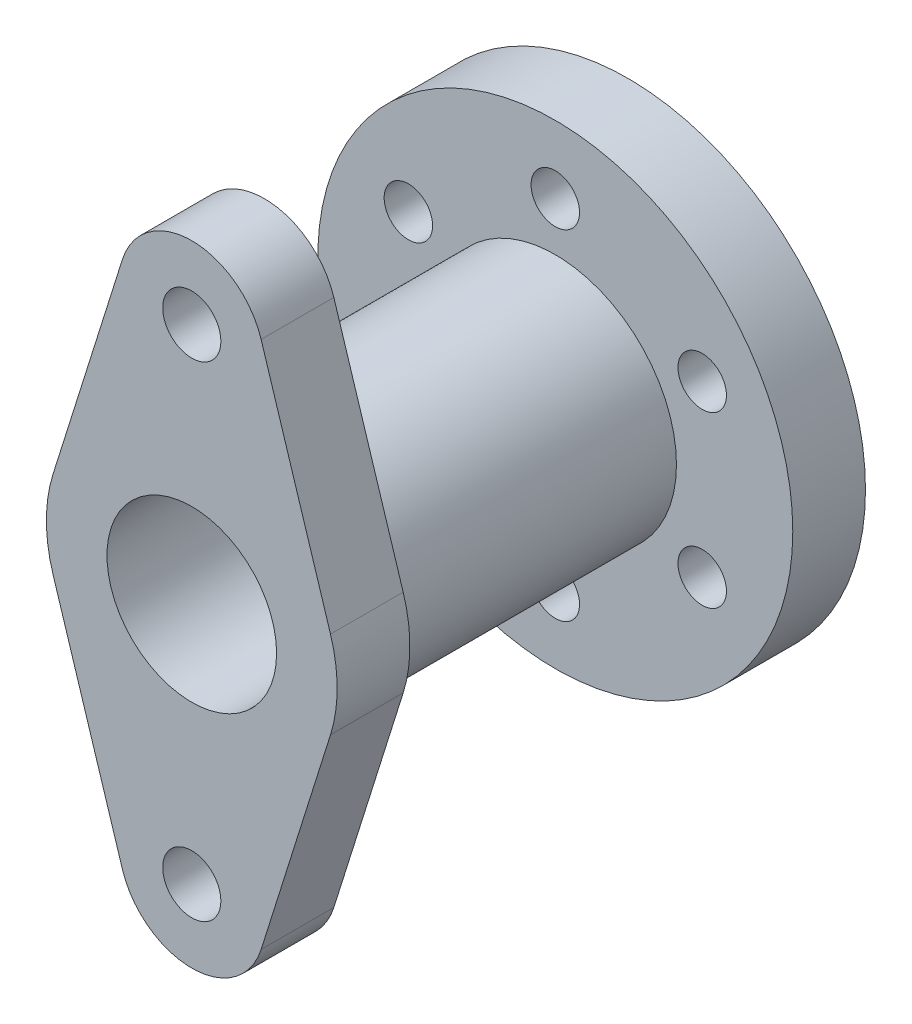
ISO-10303-21;
HEADER;
FILE_DESCRIPTION(('STEP AP214'),'2;1');
FILE_NAME('part.step','',(''),(''),'','','');
FILE_SCHEMA(('AUTOMOTIVE_DESIGN { 1 0 10303 214 1 1 1 1 }'));
ENDSEC;
DATA;
#1=APPLICATION_CONTEXT('core data for automotive mechanical design processes');
#2=APPLICATION_PROTOCOL_DEFINITION('international standard','automotive_design',2000,#1);
#3=PRODUCT_CONTEXT('',#1,'mechanical');
#4=PRODUCT('Part','Part','',(#3));
#5=PRODUCT_RELATED_PRODUCT_CATEGORY('part','',(#4));
#6=PRODUCT_DEFINITION_FORMATION('','',#4);
#7=PRODUCT_DEFINITION_CONTEXT('part definition',#1,'design');
#8=PRODUCT_DEFINITION('design','',#6,#7);
#9=PRODUCT_DEFINITION_SHAPE('','',#8);
#10=(LENGTH_UNIT() NAMED_UNIT(*) SI_UNIT(.MILLI.,.METRE.));
#11=(NAMED_UNIT(*) PLANE_ANGLE_UNIT() SI_UNIT($,.RADIAN.));
#12=(NAMED_UNIT(*) SI_UNIT($,.STERADIAN.) SOLID_ANGLE_UNIT());
#13=UNCERTAINTY_MEASURE_WITH_UNIT(LENGTH_MEASURE(1.E-05),#10,'distance_accuracy_value','');
#14=(GEOMETRIC_REPRESENTATION_CONTEXT(3) GLOBAL_UNCERTAINTY_ASSIGNED_CONTEXT((#13)) GLOBAL_UNIT_ASSIGNED_CONTEXT((#10,
#11,#12)) REPRESENTATION_CONTEXT('',''));
#15=CARTESIAN_POINT('',(0.,0.,0.));
#16=DIRECTION('',(0.,0.,1.));
#17=DIRECTION('',(1.,0.,0.));
#18=AXIS2_PLACEMENT_3D('',#15,#16,#17);
#19=CARTESIAN_POINT('',(0.,0.,15.));
#20=DIRECTION('',(0.,0.,-1.));
#21=DIRECTION('',(-1.,0.,0.));
#22=AXIS2_PLACEMENT_3D('',#19,#20,#21);
#23=CYLINDRICAL_SURFACE('',#22,49.);
#24=CARTESIAN_POINT('',(0.,0.,15.));
#25=DIRECTION('',(0.,0.,1.));
#26=DIRECTION('',(1.,0.,0.));
#27=AXIS2_PLACEMENT_3D('',#24,#25,#26);
#28=CIRCLE('',#27,49.);
#29=CARTESIAN_POINT('',(49.,0.,15.));
#30=VERTEX_POINT('',#29);
#31=EDGE_CURVE('E11',#30,#30,#28,.T.);
#32=ORIENTED_EDGE('',*,*,#31,.F.);
#33=EDGE_LOOP('',(#32));
#34=FACE_BOUND('',#33,.T.);
#35=CARTESIAN_POINT('',(0.,0.,0.));
#36=DIRECTION('',(0.,0.,1.));
#37=DIRECTION('',(1.,0.,0.));
#38=AXIS2_PLACEMENT_3D('',#35,#36,#37);
#39=CIRCLE('',#38,49.);
#40=CARTESIAN_POINT('',(49.,0.,0.));
#41=VERTEX_POINT('',#40);
#42=EDGE_CURVE('E42',#41,#41,#39,.T.);
#43=ORIENTED_EDGE('',*,*,#42,.T.);
#44=EDGE_LOOP('',(#43));
#45=FACE_BOUND('',#44,.T.);
#46=ADVANCED_FACE('F33',(#34,#45),#23,.T.);
#47=CARTESIAN_POINT('',(0.,0.,15.));
#48=DIRECTION('',(0.,0.,1.));
#49=DIRECTION('',(1.,0.,0.));
#50=AXIS2_PLACEMENT_3D('',#47,#48,#49);
#51=PLANE('',#50);
#52=CARTESIAN_POINT('',(0.,0.,15.));
#53=DIRECTION('',(0.,0.,1.));
#54=DIRECTION('',(1.,0.,0.));
#55=AXIS2_PLACEMENT_3D('',#52,#53,#54);
#56=CIRCLE('',#55,25.);
#57=CARTESIAN_POINT('',(25.,0.,15.));
#58=VERTEX_POINT('',#57);
#59=EDGE_CURVE('E161',#58,#58,#56,.T.);
#60=ORIENTED_EDGE('',*,*,#59,.F.);
#61=EDGE_LOOP('',(#60));
#62=FACE_BOUND('',#61,.T.);
#63=CARTESIAN_POINT('',(30.3108891324558,17.5000000000009,15.));
#64=DIRECTION('',(0.,0.,1.));
#65=DIRECTION('',(1.,0.,0.));
#66=AXIS2_PLACEMENT_3D('',#63,#64,#65);
#67=CIRCLE('',#66,5.0000000000003);
#68=CARTESIAN_POINT('',(35.3108891324561,17.5000000000009,15.));
#69=VERTEX_POINT('',#68);
#70=EDGE_CURVE('E172',#69,#69,#67,.T.);
#71=ORIENTED_EDGE('',*,*,#70,.F.);
#72=EDGE_LOOP('',(#71));
#73=FACE_BOUND('',#72,.T.);
#74=CARTESIAN_POINT('',(30.3108891324554,-17.5,15.));
#75=DIRECTION('',(0.,0.,1.));
#76=DIRECTION('',(1.,0.,0.));
#77=AXIS2_PLACEMENT_3D('',#74,#75,#76);
#78=CIRCLE('',#77,5.00000000000017);
#79=CARTESIAN_POINT('',(35.3108891324555,-17.5,15.));
#80=VERTEX_POINT('',#79);
#81=EDGE_CURVE('E178',#80,#80,#78,.T.);
#82=ORIENTED_EDGE('',*,*,#81,.F.);
#83=EDGE_LOOP('',(#82));
#84=FACE_BOUND('',#83,.T.);
#85=CARTESIAN_POINT('',(0.,-35.,15.));
#86=DIRECTION('',(0.,0.,1.));
#87=DIRECTION('',(1.,0.,0.));
#88=AXIS2_PLACEMENT_3D('',#85,#86,#87);
#89=CIRCLE('',#88,5.00000000000024);
#90=CARTESIAN_POINT('',(5.00000000000025,-35.,15.));
#91=VERTEX_POINT('',#90);
#92=EDGE_CURVE('E184',#91,#91,#89,.T.);
#93=ORIENTED_EDGE('',*,*,#92,.F.);
#94=EDGE_LOOP('',(#93));
#95=FACE_BOUND('',#94,.T.);
#96=CARTESIAN_POINT('',(-30.3108891324553,-17.5,15.));
#97=DIRECTION('',(0.,0.,1.));
#98=DIRECTION('',(1.,0.,0.));
#99=AXIS2_PLACEMENT_3D('',#96,#97,#98);
#100=CIRCLE('',#99,5.00000000000032);
#101=CARTESIAN_POINT('',(-25.310889132455,-17.5,15.));
#102=VERTEX_POINT('',#101);
#103=EDGE_CURVE('E190',#102,#102,#100,.T.);
#104=ORIENTED_EDGE('',*,*,#103,.F.);
#105=EDGE_LOOP('',(#104));
#106=FACE_BOUND('',#105,.T.);
#107=CARTESIAN_POINT('',(-30.3108891324549,17.4999999999991,15.));
#108=DIRECTION('',(0.,0.,1.));
#109=DIRECTION('',(1.,0.,0.));
#110=AXIS2_PLACEMENT_3D('',#107,#108,#109);
#111=CIRCLE('',#110,5.00000000000114);
#112=CARTESIAN_POINT('',(-25.3108891324537,17.4999999999991,15.));
#113=VERTEX_POINT('',#112);
#114=EDGE_CURVE('E165',#113,#113,#111,.T.);
#115=ORIENTED_EDGE('',*,*,#114,.F.);
#116=EDGE_LOOP('',(#115));
#117=FACE_BOUND('',#116,.T.);
#118=CARTESIAN_POINT('',(0.,35.,15.));
#119=DIRECTION('',(0.,0.,1.));
#120=DIRECTION('',(1.,0.,0.));
#121=AXIS2_PLACEMENT_3D('',#118,#119,#120);
#122=CIRCLE('',#121,5.);
#123=CARTESIAN_POINT('',(5.,35.,15.));
#124=VERTEX_POINT('',#123);
#125=EDGE_CURVE('E171',#124,#124,#122,.T.);
#126=ORIENTED_EDGE('',*,*,#125,.F.);
#127=EDGE_LOOP('',(#126));
#128=FACE_BOUND('',#127,.T.);
#129=ORIENTED_EDGE('',*,*,#31,.T.);
#130=EDGE_LOOP('',(#129));
#131=FACE_BOUND('',#130,.T.);
#132=ADVANCED_FACE('F253',(#62,#73,#84,#95,#106,#117,#128,#131),#51,.T.);
#133=CARTESIAN_POINT('',(0.,0.,0.));
#134=DIRECTION('',(0.,0.,1.));
#135=DIRECTION('',(1.,0.,0.));
#136=AXIS2_PLACEMENT_3D('',#133,#134,#135);
#137=PLANE('',#136);
#138=CARTESIAN_POINT('',(0.,0.,0.));
#139=DIRECTION('',(0.,0.,-1.));
#140=DIRECTION('',(-1.,0.,0.));
#141=AXIS2_PLACEMENT_3D('',#138,#139,#140);
#142=CIRCLE('',#141,13.);
#143=CARTESIAN_POINT('',(-13.,0.,0.));
#144=VERTEX_POINT('',#143);
#145=EDGE_CURVE('E435',#144,#144,#142,.T.);
#146=ORIENTED_EDGE('',*,*,#145,.F.);
#147=EDGE_LOOP('',(#146));
#148=FACE_BOUND('',#147,.T.);
#149=CARTESIAN_POINT('',(30.3108891324558,17.5000000000009,0.));
#150=DIRECTION('',(0.,0.,1.));
#151=DIRECTION('',(1.,0.,0.));
#152=AXIS2_PLACEMENT_3D('',#149,#150,#151);
#153=CIRCLE('',#152,5.0000000000003);
#154=CARTESIAN_POINT('',(35.3108891324561,17.5000000000009,0.));
#155=VERTEX_POINT('',#154);
#156=EDGE_CURVE('E168',#155,#155,#153,.T.);
#157=ORIENTED_EDGE('',*,*,#156,.T.);
#158=EDGE_LOOP('',(#157));
#159=FACE_BOUND('',#158,.T.);
#160=CARTESIAN_POINT('',(30.3108891324554,-17.5,0.));
#161=DIRECTION('',(0.,0.,1.));
#162=DIRECTION('',(1.,0.,0.));
#163=AXIS2_PLACEMENT_3D('',#160,#161,#162);
#164=CIRCLE('',#163,5.00000000000017);
#165=CARTESIAN_POINT('',(35.3108891324555,-17.5,0.));
#166=VERTEX_POINT('',#165);
#167=EDGE_CURVE('E175',#166,#166,#164,.T.);
#168=ORIENTED_EDGE('',*,*,#167,.T.);
#169=EDGE_LOOP('',(#168));
#170=FACE_BOUND('',#169,.T.);
#171=CARTESIAN_POINT('',(0.,-35.,0.));
#172=DIRECTION('',(0.,0.,1.));
#173=DIRECTION('',(1.,0.,0.));
#174=AXIS2_PLACEMENT_3D('',#171,#172,#173);
#175=CIRCLE('',#174,5.00000000000024);
#176=CARTESIAN_POINT('',(5.00000000000025,-35.,0.));
#177=VERTEX_POINT('',#176);
#178=EDGE_CURVE('E181',#177,#177,#175,.T.);
#179=ORIENTED_EDGE('',*,*,#178,.T.);
#180=EDGE_LOOP('',(#179));
#181=FACE_BOUND('',#180,.T.);
#182=CARTESIAN_POINT('',(-30.3108891324553,-17.5,0.));
#183=DIRECTION('',(0.,0.,1.));
#184=DIRECTION('',(1.,0.,0.));
#185=AXIS2_PLACEMENT_3D('',#182,#183,#184);
#186=CIRCLE('',#185,5.00000000000032);
#187=CARTESIAN_POINT('',(-25.310889132455,-17.5,0.));
#188=VERTEX_POINT('',#187);
#189=EDGE_CURVE('E187',#188,#188,#186,.T.);
#190=ORIENTED_EDGE('',*,*,#189,.T.);
#191=EDGE_LOOP('',(#190));
#192=FACE_BOUND('',#191,.T.);
#193=CARTESIAN_POINT('',(-30.3108891324549,17.4999999999991,0.));
#194=DIRECTION('',(0.,0.,1.));
#195=DIRECTION('',(1.,0.,0.));
#196=AXIS2_PLACEMENT_3D('',#193,#194,#195);
#197=CIRCLE('',#196,5.00000000000114);
#198=CARTESIAN_POINT('',(-25.3108891324537,17.4999999999991,0.));
#199=VERTEX_POINT('',#198);
#200=EDGE_CURVE('E193',#199,#199,#197,.T.);
#201=ORIENTED_EDGE('',*,*,#200,.T.);
#202=EDGE_LOOP('',(#201));
#203=FACE_BOUND('',#202,.T.);
#204=CARTESIAN_POINT('',(0.,35.,0.));
#205=DIRECTION('',(0.,0.,1.));
#206=DIRECTION('',(1.,0.,0.));
#207=AXIS2_PLACEMENT_3D('',#204,#205,#206);
#208=CIRCLE('',#207,5.);
#209=CARTESIAN_POINT('',(5.,35.,0.));
#210=VERTEX_POINT('',#209);
#211=EDGE_CURVE('E198',#210,#210,#208,.T.);
#212=ORIENTED_EDGE('',*,*,#211,.T.);
#213=EDGE_LOOP('',(#212));
#214=FACE_BOUND('',#213,.T.);
#215=ORIENTED_EDGE('',*,*,#42,.F.);
#216=EDGE_LOOP('',(#215));
#217=FACE_BOUND('',#216,.T.);
#218=ADVANCED_FACE('F258',(#148,#159,#170,#181,#192,#203,#214,#217),#137,.F.);
#219=CARTESIAN_POINT('',(0.,35.,0.));
#220=DIRECTION('',(0.,0.,1.));
#221=DIRECTION('',(1.,0.,0.));
#222=AXIS2_PLACEMENT_3D('',#219,#220,#221);
#223=CYLINDRICAL_SURFACE('',#222,5.);
#224=ORIENTED_EDGE('',*,*,#211,.F.);
#225=EDGE_LOOP('',(#224));
#226=FACE_BOUND('',#225,.T.);
#227=ORIENTED_EDGE('',*,*,#125,.T.);
#228=EDGE_LOOP('',(#227));
#229=FACE_BOUND('',#228,.T.);
#230=ADVANCED_FACE('F266',(#226,#229),#223,.F.);
#231=CARTESIAN_POINT('',(-30.3108891324549,17.4999999999991,0.));
#232=DIRECTION('',(0.,0.,1.));
#233=DIRECTION('',(1.,0.,0.));
#234=AXIS2_PLACEMENT_3D('',#231,#232,#233);
#235=CYLINDRICAL_SURFACE('',#234,5.00000000000114);
#236=ORIENTED_EDGE('',*,*,#200,.F.);
#237=EDGE_LOOP('',(#236));
#238=FACE_BOUND('',#237,.T.);
#239=ORIENTED_EDGE('',*,*,#114,.T.);
#240=EDGE_LOOP('',(#239));
#241=FACE_BOUND('',#240,.T.);
#242=ADVANCED_FACE('F271',(#238,#241),#235,.F.);
#243=CARTESIAN_POINT('',(-30.3108891324553,-17.5,0.));
#244=DIRECTION('',(0.,0.,1.));
#245=DIRECTION('',(1.,0.,0.));
#246=AXIS2_PLACEMENT_3D('',#243,#244,#245);
#247=CYLINDRICAL_SURFACE('',#246,5.00000000000032);
#248=ORIENTED_EDGE('',*,*,#189,.F.);
#249=EDGE_LOOP('',(#248));
#250=FACE_BOUND('',#249,.T.);
#251=ORIENTED_EDGE('',*,*,#103,.T.);
#252=EDGE_LOOP('',(#251));
#253=FACE_BOUND('',#252,.T.);
#254=ADVANCED_FACE('F279',(#250,#253),#247,.F.);
#255=CARTESIAN_POINT('',(0.,-35.,0.));
#256=DIRECTION('',(0.,0.,1.));
#257=DIRECTION('',(1.,0.,0.));
#258=AXIS2_PLACEMENT_3D('',#255,#256,#257);
#259=CYLINDRICAL_SURFACE('',#258,5.00000000000024);
#260=ORIENTED_EDGE('',*,*,#178,.F.);
#261=EDGE_LOOP('',(#260));
#262=FACE_BOUND('',#261,.T.);
#263=ORIENTED_EDGE('',*,*,#92,.T.);
#264=EDGE_LOOP('',(#263));
#265=FACE_BOUND('',#264,.T.);
#266=ADVANCED_FACE('F283',(#262,#265),#259,.F.);
#267=CARTESIAN_POINT('',(30.3108891324554,-17.5,0.));
#268=DIRECTION('',(0.,0.,1.));
#269=DIRECTION('',(1.,0.,0.));
#270=AXIS2_PLACEMENT_3D('',#267,#268,#269);
#271=CYLINDRICAL_SURFACE('',#270,5.00000000000017);
#272=ORIENTED_EDGE('',*,*,#167,.F.);
#273=EDGE_LOOP('',(#272));
#274=FACE_BOUND('',#273,.T.);
#275=ORIENTED_EDGE('',*,*,#81,.T.);
#276=EDGE_LOOP('',(#275));
#277=FACE_BOUND('',#276,.T.);
#278=ADVANCED_FACE('F287',(#274,#277),#271,.F.);
#279=CARTESIAN_POINT('',(30.3108891324558,17.5000000000009,0.));
#280=DIRECTION('',(0.,0.,1.));
#281=DIRECTION('',(1.,0.,0.));
#282=AXIS2_PLACEMENT_3D('',#279,#280,#281);
#283=CYLINDRICAL_SURFACE('',#282,5.0000000000003);
#284=ORIENTED_EDGE('',*,*,#156,.F.);
#285=EDGE_LOOP('',(#284));
#286=FACE_BOUND('',#285,.T.);
#287=ORIENTED_EDGE('',*,*,#70,.T.);
#288=EDGE_LOOP('',(#287));
#289=FACE_BOUND('',#288,.T.);
#290=ADVANCED_FACE('F291',(#286,#289),#283,.F.);
#291=CARTESIAN_POINT('',(0.,0.,75.));
#292=DIRECTION('',(0.,0.,-1.));
#293=DIRECTION('',(-1.,0.,0.));
#294=AXIS2_PLACEMENT_3D('',#291,#292,#293);
#295=CYLINDRICAL_SURFACE('',#294,25.);
#296=CARTESIAN_POINT('',(0.,0.,75.));
#297=DIRECTION('',(0.,0.,1.));
#298=DIRECTION('',(1.,0.,0.));
#299=AXIS2_PLACEMENT_3D('',#296,#297,#298);
#300=CIRCLE('',#299,25.);
#301=CARTESIAN_POINT('',(25.,0.,75.));
#302=VERTEX_POINT('',#301);
#303=EDGE_CURVE('E162',#302,#302,#300,.T.);
#304=ORIENTED_EDGE('',*,*,#303,.F.);
#305=EDGE_LOOP('',(#304));
#306=FACE_BOUND('',#305,.T.);
#307=ORIENTED_EDGE('',*,*,#59,.T.);
#308=EDGE_LOOP('',(#307));
#309=FACE_BOUND('',#308,.T.);
#310=ADVANCED_FACE('F295',(#306,#309),#295,.T.);
#311=CARTESIAN_POINT('',(28.6181760425084,8.99999999999999,90.));
#312=DIRECTION('',(0.953939201416946,0.3,0.));
#313=DIRECTION('',(-0.3,0.953939201416946,0.));
#314=AXIS2_PLACEMENT_3D('',#311,#312,#313);
#315=PLANE('',#314);
#316=DIRECTION('',(0.3,-0.953939201416946,0.));
#317=VECTOR('',#316,1.);
#318=CARTESIAN_POINT('',(28.6181760425084,8.99999999999999,75.));
#319=LINE('',#318,#317);
#320=CARTESIAN_POINT('',(14.3090880212542,54.5,75.));
#321=VERTEX_POINT('',#320);
#322=CARTESIAN_POINT('',(28.6181760425084,9.,75.));
#323=VERTEX_POINT('',#322);
#324=EDGE_CURVE('E132',#321,#323,#319,.T.);
#325=ORIENTED_EDGE('',*,*,#324,.F.);
#326=DIRECTION('',(0.,0.,-1.));
#327=VECTOR('',#326,1.);
#328=CARTESIAN_POINT('',(14.3090880212542,54.5,90.));
#329=LINE('',#328,#327);
#330=CARTESIAN_POINT('',(14.3090880212542,54.5,90.));
#331=VERTEX_POINT('',#330);
#332=EDGE_CURVE('E90',#331,#321,#329,.T.);
#333=ORIENTED_EDGE('',*,*,#332,.F.);
#334=DIRECTION('',(0.3,-0.953939201416946,0.));
#335=VECTOR('',#334,1.);
#336=CARTESIAN_POINT('',(28.6181760425084,8.99999999999999,90.));
#337=LINE('',#336,#335);
#338=CARTESIAN_POINT('',(28.6181760425084,9.,90.));
#339=VERTEX_POINT('',#338);
#340=EDGE_CURVE('E217',#331,#339,#337,.T.);
#341=ORIENTED_EDGE('',*,*,#340,.T.);
#342=DIRECTION('',(0.,0.,-1.));
#343=VECTOR('',#342,1.);
#344=CARTESIAN_POINT('',(28.6181760425084,9.,90.));
#345=LINE('',#344,#343);
#346=EDGE_CURVE('E86',#339,#323,#345,.T.);
#347=ORIENTED_EDGE('',*,*,#346,.T.);
#348=EDGE_LOOP('',(#325,#333,#341,#347));
#349=FACE_BOUND('',#348,.T.);
#350=ADVANCED_FACE('F236',(#349),#315,.T.);
#351=CARTESIAN_POINT('',(0.,50.,90.));
#352=DIRECTION('',(0.,0.,-1.));
#353=DIRECTION('',(-1.,0.,0.));
#354=AXIS2_PLACEMENT_3D('',#351,#352,#353);
#355=CYLINDRICAL_SURFACE('',#354,15.);
#356=CARTESIAN_POINT('',(0.,50.,75.));
#357=DIRECTION('',(0.,0.,1.));
#358=DIRECTION('',(1.,0.,0.));
#359=AXIS2_PLACEMENT_3D('',#356,#357,#358);
#360=CIRCLE('',#359,15.);
#361=CARTESIAN_POINT('',(-14.3090880212542,54.5,75.));
#362=VERTEX_POINT('',#361);
#363=EDGE_CURVE('E135',#321,#362,#360,.T.);
#364=ORIENTED_EDGE('',*,*,#363,.T.);
#365=DIRECTION('',(0.,0.,-1.));
#366=VECTOR('',#365,1.);
#367=CARTESIAN_POINT('',(-14.3090880212542,54.5,90.));
#368=LINE('',#367,#366);
#369=CARTESIAN_POINT('',(-14.3090880212542,54.5,90.));
#370=VERTEX_POINT('',#369);
#371=EDGE_CURVE('E157',#370,#362,#368,.T.);
#372=ORIENTED_EDGE('',*,*,#371,.F.);
#373=CARTESIAN_POINT('',(0.,50.,90.));
#374=DIRECTION('',(0.,0.,1.));
#375=DIRECTION('',(1.,0.,0.));
#376=AXIS2_PLACEMENT_3D('',#373,#374,#375);
#377=CIRCLE('',#376,15.);
#378=EDGE_CURVE('E219',#331,#370,#377,.T.);
#379=ORIENTED_EDGE('',*,*,#378,.F.);
#380=ORIENTED_EDGE('',*,*,#332,.T.);
#381=EDGE_LOOP('',(#364,#372,#379,#380));
#382=FACE_BOUND('',#381,.T.);
#383=ADVANCED_FACE('F239',(#382),#355,.T.);
#384=CARTESIAN_POINT('',(-28.6181760425084,8.99999999999999,90.));
#385=DIRECTION('',(0.953939201416946,-0.3,0.));
#386=DIRECTION('',(0.3,0.953939201416946,0.));
#387=AXIS2_PLACEMENT_3D('',#384,#385,#386);
#388=PLANE('',#387);
#389=DIRECTION('',(-0.3,-0.953939201416946,0.));
#390=VECTOR('',#389,1.);
#391=CARTESIAN_POINT('',(-28.6181760425084,8.99999999999999,75.));
#392=LINE('',#391,#390);
#393=CARTESIAN_POINT('',(-28.6181760425084,9.,75.));
#394=VERTEX_POINT('',#393);
#395=EDGE_CURVE('E138',#362,#394,#392,.T.);
#396=ORIENTED_EDGE('',*,*,#395,.T.);
#397=DIRECTION('',(0.,0.,-1.));
#398=VECTOR('',#397,1.);
#399=CARTESIAN_POINT('',(-28.6181760425084,9.,90.));
#400=LINE('',#399,#398);
#401=CARTESIAN_POINT('',(-28.6181760425084,9.,90.));
#402=VERTEX_POINT('',#401);
#403=EDGE_CURVE('E154',#402,#394,#400,.T.);
#404=ORIENTED_EDGE('',*,*,#403,.F.);
#405=DIRECTION('',(-0.3,-0.953939201416946,0.));
#406=VECTOR('',#405,1.);
#407=CARTESIAN_POINT('',(-28.6181760425084,8.99999999999999,90.));
#408=LINE('',#407,#406);
#409=EDGE_CURVE('E221',#370,#402,#408,.T.);
#410=ORIENTED_EDGE('',*,*,#409,.F.);
#411=ORIENTED_EDGE('',*,*,#371,.T.);
#412=EDGE_LOOP('',(#396,#404,#410,#411));
#413=FACE_BOUND('',#412,.T.);
#414=ADVANCED_FACE('F242',(#413),#388,.F.);
#415=CARTESIAN_POINT('',(0.,0.,90.));
#416=DIRECTION('',(0.,0.,-1.));
#417=DIRECTION('',(-1.,0.,0.));
#418=AXIS2_PLACEMENT_3D('',#415,#416,#417);
#419=CYLINDRICAL_SURFACE('',#418,30.);
#420=CARTESIAN_POINT('',(0.,0.,75.));
#421=DIRECTION('',(0.,0.,1.));
#422=DIRECTION('',(1.,0.,0.));
#423=AXIS2_PLACEMENT_3D('',#420,#421,#422);
#424=CIRCLE('',#423,30.);
#425=CARTESIAN_POINT('',(-28.6181760425084,-9.00000000000001,75.));
#426=VERTEX_POINT('',#425);
#427=EDGE_CURVE('E140',#394,#426,#424,.T.);
#428=ORIENTED_EDGE('',*,*,#427,.T.);
#429=DIRECTION('',(0.,0.,-1.));
#430=VECTOR('',#429,1.);
#431=CARTESIAN_POINT('',(-28.6181760425084,-9.00000000000001,90.));
#432=LINE('',#431,#430);
#433=CARTESIAN_POINT('',(-28.6181760425084,-9.00000000000001,90.));
#434=VERTEX_POINT('',#433);
#435=EDGE_CURVE('E151',#434,#426,#432,.T.);
#436=ORIENTED_EDGE('',*,*,#435,.F.);
#437=CARTESIAN_POINT('',(0.,0.,90.));
#438=DIRECTION('',(0.,0.,1.));
#439=DIRECTION('',(1.,0.,0.));
#440=AXIS2_PLACEMENT_3D('',#437,#438,#439);
#441=CIRCLE('',#440,30.);
#442=EDGE_CURVE('E129',#402,#434,#441,.T.);
#443=ORIENTED_EDGE('',*,*,#442,.F.);
#444=ORIENTED_EDGE('',*,*,#403,.T.);
#445=EDGE_LOOP('',(#428,#436,#443,#444));
#446=FACE_BOUND('',#445,.T.);
#447=ADVANCED_FACE('F227',(#446),#419,.T.);
#448=CARTESIAN_POINT('',(-28.6181760425084,-9.00000000000001,90.));
#449=DIRECTION('',(0.953939201416946,0.3,0.));
#450=DIRECTION('',(-0.3,0.953939201416946,0.));
#451=AXIS2_PLACEMENT_3D('',#448,#449,#450);
#452=PLANE('',#451);
#453=DIRECTION('',(0.3,-0.953939201416946,0.));
#454=VECTOR('',#453,1.);
#455=CARTESIAN_POINT('',(-28.6181760425084,-9.00000000000001,75.));
#456=LINE('',#455,#454);
#457=CARTESIAN_POINT('',(-14.3090880212542,-54.5,75.));
#458=VERTEX_POINT('',#457);
#459=EDGE_CURVE('E142',#426,#458,#456,.T.);
#460=ORIENTED_EDGE('',*,*,#459,.T.);
#461=DIRECTION('',(0.,0.,-1.));
#462=VECTOR('',#461,1.);
#463=CARTESIAN_POINT('',(-14.3090880212542,-54.5,90.));
#464=LINE('',#463,#462);
#465=CARTESIAN_POINT('',(-14.3090880212542,-54.5,90.));
#466=VERTEX_POINT('',#465);
#467=EDGE_CURVE('E124',#466,#458,#464,.T.);
#468=ORIENTED_EDGE('',*,*,#467,.F.);
#469=DIRECTION('',(0.3,-0.953939201416946,0.));
#470=VECTOR('',#469,1.);
#471=CARTESIAN_POINT('',(-28.6181760425084,-9.00000000000001,90.));
#472=LINE('',#471,#470);
#473=EDGE_CURVE('E111',#434,#466,#472,.T.);
#474=ORIENTED_EDGE('',*,*,#473,.F.);
#475=ORIENTED_EDGE('',*,*,#435,.T.);
#476=EDGE_LOOP('',(#460,#468,#474,#475));
#477=FACE_BOUND('',#476,.T.);
#478=ADVANCED_FACE('F231',(#477),#452,.F.);
#479=CARTESIAN_POINT('',(0.,-50.,90.));
#480=DIRECTION('',(0.,0.,-1.));
#481=DIRECTION('',(-1.,0.,0.));
#482=AXIS2_PLACEMENT_3D('',#479,#480,#481);
#483=CYLINDRICAL_SURFACE('',#482,15.);
#484=CARTESIAN_POINT('',(0.,-50.,75.));
#485=DIRECTION('',(0.,0.,1.));
#486=DIRECTION('',(1.,0.,0.));
#487=AXIS2_PLACEMENT_3D('',#484,#485,#486);
#488=CIRCLE('',#487,15.);
#489=CARTESIAN_POINT('',(14.3090880212542,-54.5,75.));
#490=VERTEX_POINT('',#489);
#491=EDGE_CURVE('E120',#458,#490,#488,.T.);
#492=ORIENTED_EDGE('',*,*,#491,.T.);
#493=DIRECTION('',(0.,0.,-1.));
#494=VECTOR('',#493,1.);
#495=CARTESIAN_POINT('',(14.3090880212542,-54.5,90.));
#496=LINE('',#495,#494);
#497=CARTESIAN_POINT('',(14.3090880212542,-54.5,90.));
#498=VERTEX_POINT('',#497);
#499=EDGE_CURVE('E117',#498,#490,#496,.T.);
#500=ORIENTED_EDGE('',*,*,#499,.F.);
#501=CARTESIAN_POINT('',(0.,-50.,90.));
#502=DIRECTION('',(0.,0.,1.));
#503=DIRECTION('',(1.,0.,0.));
#504=AXIS2_PLACEMENT_3D('',#501,#502,#503);
#505=CIRCLE('',#504,15.);
#506=EDGE_CURVE('E105',#466,#498,#505,.T.);
#507=ORIENTED_EDGE('',*,*,#506,.F.);
#508=ORIENTED_EDGE('',*,*,#467,.T.);
#509=EDGE_LOOP('',(#492,#500,#507,#508));
#510=FACE_BOUND('',#509,.T.);
#511=ADVANCED_FACE('F118',(#510),#483,.T.);
#512=CARTESIAN_POINT('',(28.6181760425084,-8.99999999999999,90.));
#513=DIRECTION('',(0.953939201416946,-0.3,0.));
#514=DIRECTION('',(0.3,0.953939201416946,0.));
#515=AXIS2_PLACEMENT_3D('',#512,#513,#514);
#516=PLANE('',#515);
#517=DIRECTION('',(-0.3,-0.953939201416946,0.));
#518=VECTOR('',#517,1.);
#519=CARTESIAN_POINT('',(28.6181760425084,-8.99999999999999,75.));
#520=LINE('',#519,#518);
#521=CARTESIAN_POINT('',(28.6181760425084,-8.99999999999999,75.));
#522=VERTEX_POINT('',#521);
#523=EDGE_CURVE('E146',#522,#490,#520,.T.);
#524=ORIENTED_EDGE('',*,*,#523,.F.);
#525=DIRECTION('',(0.,0.,-1.));
#526=VECTOR('',#525,1.);
#527=CARTESIAN_POINT('',(28.6181760425084,-8.99999999999999,90.));
#528=LINE('',#527,#526);
#529=CARTESIAN_POINT('',(28.6181760425084,-8.99999999999999,90.));
#530=VERTEX_POINT('',#529);
#531=EDGE_CURVE('E79',#530,#522,#528,.T.);
#532=ORIENTED_EDGE('',*,*,#531,.F.);
#533=DIRECTION('',(-0.3,-0.953939201416946,0.));
#534=VECTOR('',#533,1.);
#535=CARTESIAN_POINT('',(28.6181760425084,-8.99999999999999,90.));
#536=LINE('',#535,#534);
#537=EDGE_CURVE('E109',#530,#498,#536,.T.);
#538=ORIENTED_EDGE('',*,*,#537,.T.);
#539=ORIENTED_EDGE('',*,*,#499,.T.);
#540=EDGE_LOOP('',(#524,#532,#538,#539));
#541=FACE_BOUND('',#540,.T.);
#542=ADVANCED_FACE('F126',(#541),#516,.T.);
#543=EDGE_CURVE('E143',#522,#323,#424,.T.);
#544=ORIENTED_EDGE('',*,*,#543,.T.);
#545=ORIENTED_EDGE('',*,*,#346,.F.);
#546=EDGE_CURVE('E51',#530,#339,#441,.T.);
#547=ORIENTED_EDGE('',*,*,#546,.F.);
#548=ORIENTED_EDGE('',*,*,#531,.T.);
#549=EDGE_LOOP('',(#544,#545,#547,#548));
#550=FACE_BOUND('',#549,.T.);
#551=ADVANCED_FACE('F235',(#550),#419,.T.);
#552=CARTESIAN_POINT('',(0.,0.,90.));
#553=DIRECTION('',(0.,0.,1.));
#554=DIRECTION('',(1.,0.,0.));
#555=AXIS2_PLACEMENT_3D('',#552,#553,#554);
#556=PLANE('',#555);
#557=CARTESIAN_POINT('',(0.,0.,90.));
#558=DIRECTION('',(0.,0.,1.));
#559=DIRECTION('',(1.,0.,0.));
#560=AXIS2_PLACEMENT_3D('',#557,#558,#559);
#561=CIRCLE('',#560,17.5);
#562=CARTESIAN_POINT('',(17.5,0.,90.));
#563=VERTEX_POINT('',#562);
#564=EDGE_CURVE('E437',#563,#563,#561,.T.);
#565=ORIENTED_EDGE('',*,*,#564,.F.);
#566=EDGE_LOOP('',(#565));
#567=FACE_BOUND('',#566,.T.);
#568=CARTESIAN_POINT('',(0.,-50.,90.));
#569=DIRECTION('',(0.,0.,1.));
#570=DIRECTION('',(1.,0.,0.));
#571=AXIS2_PLACEMENT_3D('',#568,#569,#570);
#572=CIRCLE('',#571,6.);
#573=CARTESIAN_POINT('',(6.00000000000002,-50.,90.));
#574=VERTEX_POINT('',#573);
#575=EDGE_CURVE('E213',#574,#574,#572,.T.);
#576=ORIENTED_EDGE('',*,*,#575,.F.);
#577=EDGE_LOOP('',(#576));
#578=FACE_BOUND('',#577,.T.);
#579=CARTESIAN_POINT('',(0.,50.,90.));
#580=DIRECTION('',(0.,0.,1.));
#581=DIRECTION('',(1.,0.,0.));
#582=AXIS2_PLACEMENT_3D('',#579,#580,#581);
#583=CIRCLE('',#582,6.);
#584=CARTESIAN_POINT('',(6.,50.,90.));
#585=VERTEX_POINT('',#584);
#586=EDGE_CURVE('E205',#585,#585,#583,.T.);
#587=ORIENTED_EDGE('',*,*,#586,.F.);
#588=EDGE_LOOP('',(#587));
#589=FACE_BOUND('',#588,.T.);
#590=ORIENTED_EDGE('',*,*,#340,.F.);
#591=ORIENTED_EDGE('',*,*,#378,.T.);
#592=ORIENTED_EDGE('',*,*,#409,.T.);
#593=ORIENTED_EDGE('',*,*,#442,.T.);
#594=ORIENTED_EDGE('',*,*,#473,.T.);
#595=ORIENTED_EDGE('',*,*,#506,.T.);
#596=ORIENTED_EDGE('',*,*,#537,.F.);
#597=ORIENTED_EDGE('',*,*,#546,.T.);
#598=EDGE_LOOP('',(#590,#591,#592,#593,#594,#595,#596,#597));
#599=FACE_BOUND('',#598,.T.);
#600=ADVANCED_FACE('F107',(#567,#578,#589,#599),#556,.T.);
#601=CARTESIAN_POINT('',(0.,0.,75.));
#602=DIRECTION('',(0.,0.,1.));
#603=DIRECTION('',(1.,0.,0.));
#604=AXIS2_PLACEMENT_3D('',#601,#602,#603);
#605=PLANE('',#604);
#606=CARTESIAN_POINT('',(0.,-50.,75.));
#607=DIRECTION('',(0.,0.,1.));
#608=DIRECTION('',(1.,0.,0.));
#609=AXIS2_PLACEMENT_3D('',#606,#607,#608);
#610=CIRCLE('',#609,6.);
#611=CARTESIAN_POINT('',(6.00000000000002,-50.,75.));
#612=VERTEX_POINT('',#611);
#613=EDGE_CURVE('E36',#612,#612,#610,.T.);
#614=ORIENTED_EDGE('',*,*,#613,.T.);
#615=EDGE_LOOP('',(#614));
#616=FACE_BOUND('',#615,.T.);
#617=CARTESIAN_POINT('',(0.,50.,75.));
#618=DIRECTION('',(0.,0.,1.));
#619=DIRECTION('',(1.,0.,0.));
#620=AXIS2_PLACEMENT_3D('',#617,#618,#619);
#621=CIRCLE('',#620,6.);
#622=CARTESIAN_POINT('',(6.,50.,75.));
#623=VERTEX_POINT('',#622);
#624=EDGE_CURVE('E136',#623,#623,#621,.T.);
#625=ORIENTED_EDGE('',*,*,#624,.T.);
#626=EDGE_LOOP('',(#625));
#627=FACE_BOUND('',#626,.T.);
#628=ORIENTED_EDGE('',*,*,#303,.T.);
#629=EDGE_LOOP('',(#628));
#630=FACE_BOUND('',#629,.T.);
#631=ORIENTED_EDGE('',*,*,#324,.T.);
#632=ORIENTED_EDGE('',*,*,#543,.F.);
#633=ORIENTED_EDGE('',*,*,#523,.T.);
#634=ORIENTED_EDGE('',*,*,#491,.F.);
#635=ORIENTED_EDGE('',*,*,#459,.F.);
#636=ORIENTED_EDGE('',*,*,#427,.F.);
#637=ORIENTED_EDGE('',*,*,#395,.F.);
#638=ORIENTED_EDGE('',*,*,#363,.F.);
#639=EDGE_LOOP('',(#631,#632,#633,#634,#635,#636,#637,#638));
#640=FACE_BOUND('',#639,.T.);
#641=ADVANCED_FACE('F233',(#616,#627,#630,#640),#605,.F.);
#642=CARTESIAN_POINT('',(0.,50.,57.));
#643=DIRECTION('',(0.,0.,1.));
#644=DIRECTION('',(1.,0.,0.));
#645=AXIS2_PLACEMENT_3D('',#642,#643,#644);
#646=CYLINDRICAL_SURFACE('',#645,6.);
#647=ORIENTED_EDGE('',*,*,#586,.T.);
#648=EDGE_LOOP('',(#647));
#649=FACE_BOUND('',#648,.T.);
#650=ORIENTED_EDGE('',*,*,#624,.F.);
#651=EDGE_LOOP('',(#650));
#652=FACE_BOUND('',#651,.T.);
#653=ADVANCED_FACE('F360',(#649,#652),#646,.F.);
#654=CARTESIAN_POINT('',(0.,-50.,57.));
#655=DIRECTION('',(0.,0.,1.));
#656=DIRECTION('',(1.,0.,0.));
#657=AXIS2_PLACEMENT_3D('',#654,#655,#656);
#658=CYLINDRICAL_SURFACE('',#657,6.);
#659=ORIENTED_EDGE('',*,*,#575,.T.);
#660=EDGE_LOOP('',(#659));
#661=FACE_BOUND('',#660,.T.);
#662=ORIENTED_EDGE('',*,*,#613,.F.);
#663=EDGE_LOOP('',(#662));
#664=FACE_BOUND('',#663,.T.);
#665=ADVANCED_FACE('F371',(#661,#664),#658,.F.);
#666=CARTESIAN_POINT('',(0.,0.,60.));
#667=DIRECTION('',(0.,0.,1.));
#668=DIRECTION('',(1.,0.,0.));
#669=AXIS2_PLACEMENT_3D('',#666,#667,#668);
#670=CYLINDRICAL_SURFACE('',#669,17.5);
#671=CARTESIAN_POINT('',(0.,0.,60.));
#672=DIRECTION('',(0.,0.,1.));
#673=DIRECTION('',(1.,0.,0.));
#674=AXIS2_PLACEMENT_3D('',#671,#672,#673);
#675=CIRCLE('',#674,17.5);
#676=CARTESIAN_POINT('',(17.5,0.,60.));
#677=VERTEX_POINT('',#676);
#678=EDGE_CURVE('E440',#677,#677,#675,.T.);
#679=ORIENTED_EDGE('',*,*,#678,.F.);
#680=EDGE_LOOP('',(#679));
#681=FACE_BOUND('',#680,.T.);
#682=ORIENTED_EDGE('',*,*,#564,.T.);
#683=EDGE_LOOP('',(#682));
#684=FACE_BOUND('',#683,.T.);
#685=ADVANCED_FACE('F380',(#681,#684),#670,.F.);
#686=CARTESIAN_POINT('',(0.,0.,60.));
#687=DIRECTION('',(0.,0.,1.));
#688=DIRECTION('',(1.,0.,0.));
#689=AXIS2_PLACEMENT_3D('',#686,#687,#688);
#690=PLANE('',#689);
#691=CARTESIAN_POINT('',(0.,0.,60.));
#692=DIRECTION('',(0.,0.,-1.));
#693=DIRECTION('',(-1.,0.,0.));
#694=AXIS2_PLACEMENT_3D('',#691,#692,#693);
#695=CIRCLE('',#694,13.);
#696=CARTESIAN_POINT('',(-13.,0.,60.));
#697=VERTEX_POINT('',#696);
#698=EDGE_CURVE('E433',#697,#697,#695,.T.);
#699=ORIENTED_EDGE('',*,*,#698,.T.);
#700=EDGE_LOOP('',(#699));
#701=FACE_BOUND('',#700,.T.);
#702=ORIENTED_EDGE('',*,*,#678,.T.);
#703=EDGE_LOOP('',(#702));
#704=FACE_BOUND('',#703,.T.);
#705=ADVANCED_FACE('F399',(#701,#704),#690,.T.);
#706=CARTESIAN_POINT('',(0.,0.,60.));
#707=DIRECTION('',(0.,0.,-1.));
#708=DIRECTION('',(-1.,0.,0.));
#709=AXIS2_PLACEMENT_3D('',#706,#707,#708);
#710=CYLINDRICAL_SURFACE('',#709,13.);
#711=ORIENTED_EDGE('',*,*,#698,.F.);
#712=EDGE_LOOP('',(#711));
#713=FACE_BOUND('',#712,.T.);
#714=ORIENTED_EDGE('',*,*,#145,.T.);
#715=EDGE_LOOP('',(#714));
#716=FACE_BOUND('',#715,.T.);
#717=ADVANCED_FACE('F416',(#713,#716),#710,.F.);
#718=CLOSED_SHELL('',(#46,#132,#218,#230,#242,#254,#266,#278,#290,#310,#350,#383,#414,#447,#478,
#511,#542,#551,#600,#641,#653,#665,#685,#705,#717));
#719=MANIFOLD_SOLID_BREP('B2',#718);
#720=ADVANCED_BREP_SHAPE_REPRESENTATION('',(#18,#719),#14);
#721=SHAPE_DEFINITION_REPRESENTATION(#9,#720);
ENDSEC;
END-ISO-10303-21;
